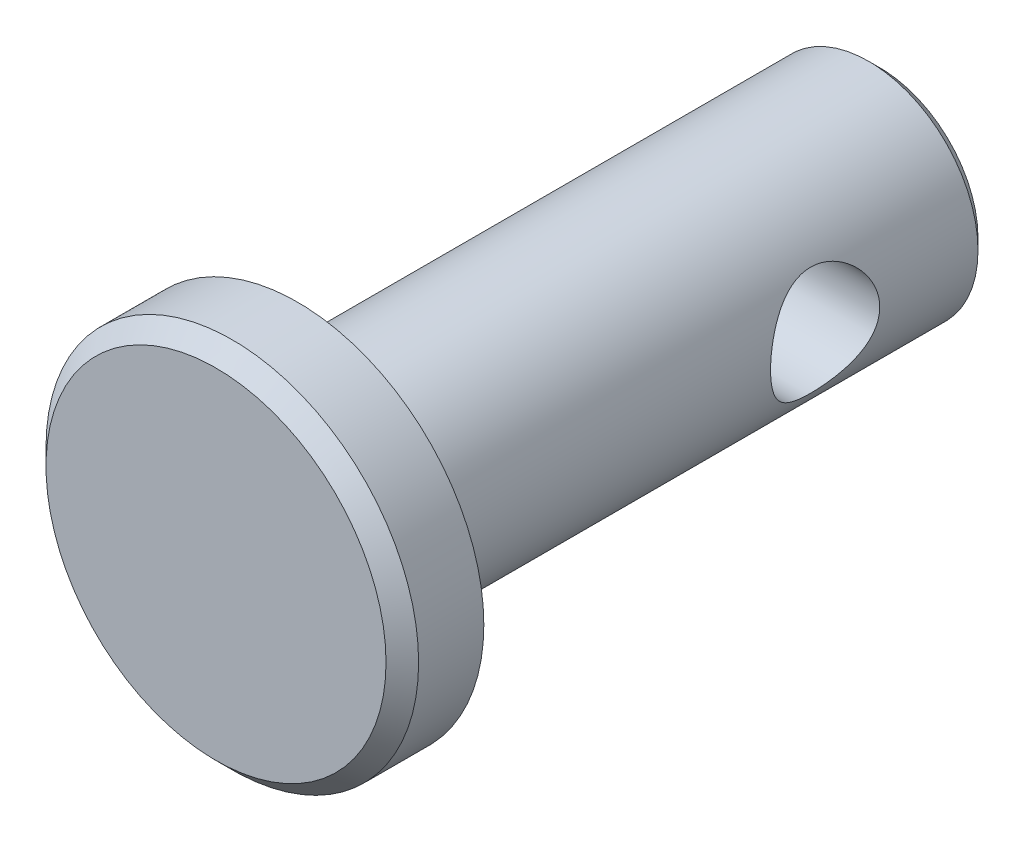
ISO-10303-21;
HEADER;
FILE_DESCRIPTION(('STEP AP214'),'2;1');
FILE_NAME('part.step','',(''),(''),'','','');
FILE_SCHEMA(('AUTOMOTIVE_DESIGN { 1 0 10303 214 1 1 1 1 }'));
ENDSEC;
DATA;
#1=APPLICATION_CONTEXT('core data for automotive mechanical design processes');
#2=APPLICATION_PROTOCOL_DEFINITION('international standard','automotive_design',2000,#1);
#3=PRODUCT_CONTEXT('',#1,'mechanical');
#4=PRODUCT('Part','Part','',(#3));
#5=PRODUCT_RELATED_PRODUCT_CATEGORY('part','',(#4));
#6=PRODUCT_DEFINITION_FORMATION('','',#4);
#7=PRODUCT_DEFINITION_CONTEXT('part definition',#1,'design');
#8=PRODUCT_DEFINITION('design','',#6,#7);
#9=PRODUCT_DEFINITION_SHAPE('','',#8);
#10=(LENGTH_UNIT() NAMED_UNIT(*) SI_UNIT(.MILLI.,.METRE.));
#11=(NAMED_UNIT(*) PLANE_ANGLE_UNIT() SI_UNIT($,.RADIAN.));
#12=(NAMED_UNIT(*) SI_UNIT($,.STERADIAN.) SOLID_ANGLE_UNIT());
#13=UNCERTAINTY_MEASURE_WITH_UNIT(LENGTH_MEASURE(1.E-05),#10,'distance_accuracy_value','');
#14=(GEOMETRIC_REPRESENTATION_CONTEXT(3) GLOBAL_UNCERTAINTY_ASSIGNED_CONTEXT((#13)) GLOBAL_UNIT_ASSIGNED_CONTEXT((#10,
#11,#12)) REPRESENTATION_CONTEXT('',''));
#15=CARTESIAN_POINT('',(0.,0.,0.));
#16=DIRECTION('',(0.,0.,1.));
#17=DIRECTION('',(1.,0.,0.));
#18=AXIS2_PLACEMENT_3D('',#15,#16,#17);
#19=CARTESIAN_POINT('',(0.,0.,6.35));
#20=DIRECTION('',(0.,0.,-1.));
#21=DIRECTION('',(-1.,0.,0.));
#22=AXIS2_PLACEMENT_3D('',#19,#20,#21);
#23=CYLINDRICAL_SURFACE('',#22,2.38125);
#24=CARTESIAN_POINT('',(0.,0.,-6.111875));
#25=DIRECTION('',(0.,0.,1.));
#26=DIRECTION('',(1.,0.,0.));
#27=AXIS2_PLACEMENT_3D('',#24,#25,#26);
#28=CIRCLE('',#27,2.38125);
#29=CARTESIAN_POINT('',(2.38125,0.,-6.111875));
#30=VERTEX_POINT('',#29);
#31=EDGE_CURVE('E37',#30,#30,#28,.T.);
#32=ORIENTED_EDGE('',*,*,#31,.T.);
#33=EDGE_LOOP('',(#32));
#34=FACE_BOUND('',#33,.T.);
#35=CARTESIAN_POINT('',(-2.38125,0.,-1.58749999999999));
#36=CARTESIAN_POINT('',(-2.38124658771817,-0.0625934933908996,-1.58750393182415));
#37=CARTESIAN_POINT('',(-2.37875553370113,-0.12526160776547,-1.59246499331048));
#38=CARTESIAN_POINT('',(-2.36903604532025,-0.248745655116469,-1.61208983565589));
#39=CARTESIAN_POINT('',(-2.36179861446384,-0.309557840743266,-1.62677204291282));
#40=CARTESIAN_POINT('',(-2.34334382664568,-0.427355251873435,-1.66512137838436));
#41=CARTESIAN_POINT('',(-2.33214194770735,-0.484354349749462,-1.68875358874528));
#42=CARTESIAN_POINT('',(-2.30678565164099,-0.593493959385318,-1.74415127106262));
#43=CARTESIAN_POINT('',(-2.29263146732421,-0.645634853781904,-1.77591610174628));
#44=CARTESIAN_POINT('',(-2.26166669988499,-0.747126495522786,-1.84886272516842));
#45=CARTESIAN_POINT('',(-2.24474721461222,-0.796117610742266,-1.89049796434469));
#46=CARTESIAN_POINT('',(-2.2105140207503,-0.886753026544747,-1.98102713622849));
#47=CARTESIAN_POINT('',(-2.19320002298882,-0.928391728636496,-2.02992654851655));
#48=CARTESIAN_POINT('',(-2.15859063769341,-1.00637816303612,-2.13814423802627));
#49=CARTESIAN_POINT('',(-2.14140081986313,-1.04206516514117,-2.19797641709309));
#50=CARTESIAN_POINT('',(-2.11081118475794,-1.10271904514174,-2.32374360940858));
#51=CARTESIAN_POINT('',(-2.09740866244572,-1.12769358094429,-2.38967422201051));
#52=CARTESIAN_POINT('',(-2.07713897941891,-1.16458893898079,-2.52174189114297));
#53=CARTESIAN_POINT('',(-2.06992860854359,-1.1772017235864,-2.58763030074273));
#54=CARTESIAN_POINT('',(-2.06194687719966,-1.19113338890835,-2.72094980373118));
#55=CARTESIAN_POINT('',(-2.06116915374352,-1.19246343021919,-2.78837930647471));
#56=CARTESIAN_POINT('',(-2.06586451337536,-1.18429955128952,-2.91419679770048));
#57=CARTESIAN_POINT('',(-2.07060121735085,-1.17608099119853,-2.97270173717494));
#58=CARTESIAN_POINT('',(-2.0845013483624,-1.15126275778341,-3.08735639834727));
#59=CARTESIAN_POINT('',(-2.09366618546583,-1.13466041470314,-3.14350536362913));
#60=CARTESIAN_POINT('',(-2.1155915160392,-1.09324351977209,-3.25345718596098));
#61=CARTESIAN_POINT('',(-2.12843079040573,-1.06824668928498,-3.30717493105432));
#62=CARTESIAN_POINT('',(-2.15626240722546,-1.01089025937972,-3.40991145461497));
#63=CARTESIAN_POINT('',(-2.17125571566414,-0.978527352789222,-3.45892810832385));
#64=CARTESIAN_POINT('',(-2.20400353628599,-0.902572396630542,-3.5574143665474));
#65=CARTESIAN_POINT('',(-2.22186710625626,-0.858076839495929,-3.60615334010161));
#66=CARTESIAN_POINT('',(-2.25680138992047,-0.761470860938951,-3.69578185775979));
#67=CARTESIAN_POINT('',(-2.27387172175947,-0.709356821108761,-3.73666765051534));
#68=CARTESIAN_POINT('',(-2.30626428608779,-0.595927464756047,-3.81121324016351));
#69=CARTESIAN_POINT('',(-2.3214685301789,-0.534297244998048,-3.8444493125057));
#70=CARTESIAN_POINT('',(-2.34741102209979,-0.405367587816351,-3.89980927520433));
#71=CARTESIAN_POINT('',(-2.35815281492167,-0.338072701740847,-3.92194198903368));
#72=CARTESIAN_POINT('',(-2.37320534860897,-0.205700104133525,-3.95264727755016));
#73=CARTESIAN_POINT('',(-2.37797504664999,-0.1409003848091,-3.962191127561));
#74=CARTESIAN_POINT('',(-2.38211931649743,-0.0104532111897002,-3.970493945507));
#75=CARTESIAN_POINT('',(-2.38149644415062,0.0551938267826006,-3.9692580225895));
#76=CARTESIAN_POINT('',(-2.37519200776753,0.180061757270823,-3.95659766160142));
#77=CARTESIAN_POINT('',(-2.36990626897501,0.239386357709476,-3.9459703282183));
#78=CARTESIAN_POINT('',(-2.35532022721706,0.355290706146969,-3.91607904564991));
#79=CARTESIAN_POINT('',(-2.34601948166815,0.411870150775843,-3.89681414431647));
#80=CARTESIAN_POINT('',(-2.323912493394,0.522551749435383,-3.849689325903));
#81=CARTESIAN_POINT('',(-2.31101362357334,0.576536816435452,-3.82159940595467));
#82=CARTESIAN_POINT('',(-2.28295169421308,0.679205558772778,-3.75788134037143));
#83=CARTESIAN_POINT('',(-2.26778767095513,0.727886962326196,-3.72224998349969));
#84=CARTESIAN_POINT('',(-2.23490101029918,0.823635905061685,-3.64042274358804));
#85=CARTESIAN_POINT('',(-2.21707334772675,0.870075505159962,-3.59353302224747));
#86=CARTESIAN_POINT('',(-2.18196785003363,0.954710182325452,-3.49258911676998));
#87=CARTESIAN_POINT('',(-2.1646904022613,0.992899556088159,-3.43853001790925));
#88=CARTESIAN_POINT('',(-2.13182825744162,1.06168973569882,-3.32147427421775));
#89=CARTESIAN_POINT('',(-2.11636605630571,1.0918334810305,-3.25817158617039));
#90=CARTESIAN_POINT('',(-2.090428799133,1.14071736472269,-3.12637082565359));
#91=CARTESIAN_POINT('',(-2.07994732092736,1.15947219672864,-3.05787957625952));
#92=CARTESIAN_POINT('',(-2.06646662138444,1.18331657161978,-2.92467876590558));
#93=CARTESIAN_POINT('',(-2.06284572182647,1.18954509883978,-2.86023734201105));
#94=CARTESIAN_POINT('',(-2.06175000375602,1.19144552443463,-2.73115833564985));
#95=CARTESIAN_POINT('',(-2.06427252119055,1.18712199863718,-2.66652085034461));
#96=CARTESIAN_POINT('',(-2.0745195450331,1.16910579328329,-2.54537745598844));
#97=CARTESIAN_POINT('',(-2.081725593681,1.1563448992644,-2.48868350273432));
#98=CARTESIAN_POINT('',(-2.09991741148739,1.12296816088622,-2.37830345780995));
#99=CARTESIAN_POINT('',(-2.11090439637645,1.10234978978715,-2.32461834007174));
#100=CARTESIAN_POINT('',(-2.13632093965266,1.05229312174863,-2.21778728679406));
#101=CARTESIAN_POINT('',(-2.15093219477964,1.02235532346272,-2.16491990438401));
#102=CARTESIAN_POINT('',(-2.18164566727434,0.955061000604871,-2.06461375535998));
#103=CARTESIAN_POINT('',(-2.19774865799103,0.917700616381019,-2.01717783335142));
#104=CARTESIAN_POINT('',(-2.23197328511557,0.831298335810092,-1.92308720225546));
#105=CARTESIAN_POINT('',(-2.25010245755217,0.781388641146489,-1.87722775625033));
#106=CARTESIAN_POINT('',(-2.28454448778714,0.674078066156024,-1.79435563536123));
#107=CARTESIAN_POINT('',(-2.30085636405197,0.616673173627613,-1.75734772899557));
#108=CARTESIAN_POINT('',(-2.33002942662263,0.495218557463752,-1.69318420558624));
#109=CARTESIAN_POINT('',(-2.34286539970213,0.431124721872153,-1.6661000982945));
#110=CARTESIAN_POINT('',(-2.36340659560876,0.298539814353399,-1.62344715007149));
#111=CARTESIAN_POINT('',(-2.37112639390897,0.230061848926335,-1.60784558236852));
#112=CARTESIAN_POINT('',(-2.37762409336193,0.134066692531781,-1.59476589493781));
#113=CARTESIAN_POINT('',(-2.37898025606987,0.107348987707655,-1.59204504322174));
#114=CARTESIAN_POINT('',(-2.3807939546427,0.0537587806828979,-1.58841122636904));
#115=CARTESIAN_POINT('',(-2.38125146570418,0.0268862742301639,-1.58749831113272));
#116=CARTESIAN_POINT('',(-2.38125,0.,-1.58749999999999));
#117=B_SPLINE_CURVE_WITH_KNOTS('',3,(#35,#36,#37,#38,#39,#40,#41,#42,#43,#44,#45,#46,#47,#48,
#49,#50,#51,#52,#53,#54,#55,#56,#57,#58,#59,#60,#61,#62,#63,#64,#65,#66,#67,#68,#69,#70,#71,#72,
#73,#74,#75,#76,#77,#78,#79,#80,#81,#82,#83,#84,#85,#86,#87,#88,#89,#90,#91,#92,#93,#94,#95,#96,
#97,#98,#99,#100,#101,#102,#103,#104,#105,#106,#107,#108,#109,#110,#111,#112,#113,#114,#115,
#116),.UNSPECIFIED.,.T.,.F.,(4,2,2,2,2,2,2,2,2,2,2,2,2,2,2,2,2,2,2,2,2,2,2,2,2,2,2,2,2,2,2,2,2,
2,2,2,2,2,2,2,4),(0.,0.187671381491036,0.375699515747514,0.563001503883019,0.750288727442431,
0.948906406473727,1.14767467670684,1.36185743031615,1.57588681716391,1.77710320704461,
1.97812053569865,2.15509926337348,2.33213438424011,2.51329317200606,2.69453345625452,
2.8987544577565,3.10307277131562,3.31687910824069,3.53051527011184,3.72645730217447,
3.92230647121477,4.10297598058852,4.28366541066829,4.46952119208218,4.65545627297242,
4.85965036423512,5.06398516445249,5.27821543446363,5.4921687202949,5.68558331740252,
5.8789140564582,6.05382723196981,6.22879670208068,6.41552156348467,6.60234377481073,
6.81186617152195,7.02150118957733,7.23261841267422,7.44313156831559,7.52374130413948,
7.60435326481741),.UNSPECIFIED.);
#118=CARTESIAN_POINT('',(-2.38125,0.,-1.58749999999999));
#119=VERTEX_POINT('',#118);
#120=EDGE_CURVE('E48',#119,#119,#117,.T.);
#121=ORIENTED_EDGE('',*,*,#120,.T.);
#122=EDGE_LOOP('',(#121));
#123=FACE_BOUND('',#122,.T.);
#124=CARTESIAN_POINT('',(2.38125,0.,-3.96874999999999));
#125=CARTESIAN_POINT('',(2.38124658771817,-0.0625934933908997,-3.96874606817584));
#126=CARTESIAN_POINT('',(2.37875553370113,-0.12526160776547,-3.9637850066895));
#127=CARTESIAN_POINT('',(2.36903604532025,-0.248745655116469,-3.94416016434409));
#128=CARTESIAN_POINT('',(2.36179861446383,-0.309557840743266,-3.92947795708717));
#129=CARTESIAN_POINT('',(2.34334382664568,-0.427355251873435,-3.89112862161562));
#130=CARTESIAN_POINT('',(2.33214194770735,-0.484354349749462,-3.86749641125471));
#131=CARTESIAN_POINT('',(2.30678565164099,-0.593493959385317,-3.81209872893736));
#132=CARTESIAN_POINT('',(2.29263146732421,-0.645634853781904,-3.78033389825371));
#133=CARTESIAN_POINT('',(2.26166669988499,-0.747126495522786,-3.70738727483156));
#134=CARTESIAN_POINT('',(2.24474721461222,-0.796117610742266,-3.6657520356553));
#135=CARTESIAN_POINT('',(2.2105140207503,-0.886753026544747,-3.5752228637715));
#136=CARTESIAN_POINT('',(2.19320002298882,-0.928391728636496,-3.52632345148343));
#137=CARTESIAN_POINT('',(2.15859063769341,-1.00637816303612,-3.41810576197372));
#138=CARTESIAN_POINT('',(2.14140081986313,-1.04206516514117,-3.35827358290689));
#139=CARTESIAN_POINT('',(2.11081118475794,-1.10271904514174,-3.23250639059141));
#140=CARTESIAN_POINT('',(2.09740866244572,-1.12769358094429,-3.16657577798947));
#141=CARTESIAN_POINT('',(2.07713897941891,-1.16458893898079,-3.03450810885702));
#142=CARTESIAN_POINT('',(2.06992860854359,-1.1772017235864,-2.96861969925725));
#143=CARTESIAN_POINT('',(2.06194687719966,-1.19113338890835,-2.8353001962688));
#144=CARTESIAN_POINT('',(2.06116915374352,-1.19246343021919,-2.76787069352527));
#145=CARTESIAN_POINT('',(2.06586451337536,-1.18429955128952,-2.64205320229951));
#146=CARTESIAN_POINT('',(2.07060121735085,-1.17608099119853,-2.58354826282505));
#147=CARTESIAN_POINT('',(2.0845013483624,-1.15126275778341,-2.46889360165271));
#148=CARTESIAN_POINT('',(2.09366618546583,-1.13466041470314,-2.41274463637085));
#149=CARTESIAN_POINT('',(2.1155915160392,-1.09324351977209,-2.302792814039));
#150=CARTESIAN_POINT('',(2.12843079040573,-1.06824668928498,-2.24907506894566));
#151=CARTESIAN_POINT('',(2.15626240722546,-1.01089025937972,-2.14633854538501));
#152=CARTESIAN_POINT('',(2.17125571566414,-0.978527352789222,-2.09732189167614));
#153=CARTESIAN_POINT('',(2.204003536286,-0.902572396630541,-1.99883563345259));
#154=CARTESIAN_POINT('',(2.22186710625626,-0.858076839495928,-1.95009665989838));
#155=CARTESIAN_POINT('',(2.25680138992047,-0.76147086093895,-1.8604681422402));
#156=CARTESIAN_POINT('',(2.27387172175947,-0.709356821108761,-1.81958234948465));
#157=CARTESIAN_POINT('',(2.30626428608779,-0.595927464756047,-1.74503675983647));
#158=CARTESIAN_POINT('',(2.3214685301789,-0.534297244998048,-1.71180068749428));
#159=CARTESIAN_POINT('',(2.34741102209979,-0.40536758781635,-1.65644072479566));
#160=CARTESIAN_POINT('',(2.35815281492167,-0.338072701740846,-1.63430801096631));
#161=CARTESIAN_POINT('',(2.37320534860897,-0.205700104133524,-1.60360272244982));
#162=CARTESIAN_POINT('',(2.37797504664999,-0.140900384809099,-1.59405887243898));
#163=CARTESIAN_POINT('',(2.38211931649743,-0.0104532111896996,-1.58575605449299));
#164=CARTESIAN_POINT('',(2.38149644415062,0.055193826782601,-1.58699197741048));
#165=CARTESIAN_POINT('',(2.37519200776753,0.180061757270823,-1.59965233839857));
#166=CARTESIAN_POINT('',(2.36990626897501,0.239386357709477,-1.61027967178168));
#167=CARTESIAN_POINT('',(2.35532022721706,0.35529070614697,-1.64017095435008));
#168=CARTESIAN_POINT('',(2.34601948166815,0.411870150775843,-1.65943585568352));
#169=CARTESIAN_POINT('',(2.323912493394,0.522551749435383,-1.70656067409698));
#170=CARTESIAN_POINT('',(2.31101362357334,0.576536816435452,-1.73465059404532));
#171=CARTESIAN_POINT('',(2.28295169421308,0.679205558772778,-1.79836865962856));
#172=CARTESIAN_POINT('',(2.26778767095513,0.727886962326196,-1.83400001650029));
#173=CARTESIAN_POINT('',(2.23490101029918,0.823635905061685,-1.91582725641194));
#174=CARTESIAN_POINT('',(2.21707334772675,0.870075505159963,-1.96271697775252));
#175=CARTESIAN_POINT('',(2.18196785003363,0.954710182325453,-2.06366088323001));
#176=CARTESIAN_POINT('',(2.1646904022613,0.99289955608816,-2.11771998209074));
#177=CARTESIAN_POINT('',(2.13182825744162,1.06168973569882,-2.23477572578224));
#178=CARTESIAN_POINT('',(2.11636605630571,1.0918334810305,-2.2980784138296));
#179=CARTESIAN_POINT('',(2.090428799133,1.14071736472269,-2.4298791743464));
#180=CARTESIAN_POINT('',(2.07994732092736,1.15947219672864,-2.49837042374047));
#181=CARTESIAN_POINT('',(2.06646662138444,1.18331657161978,-2.6315712340944));
#182=CARTESIAN_POINT('',(2.06284572182647,1.18954509883978,-2.69601265798894));
#183=CARTESIAN_POINT('',(2.06175000375602,1.19144552443463,-2.82509166435014));
#184=CARTESIAN_POINT('',(2.06427252119055,1.18712199863718,-2.88972914965538));
#185=CARTESIAN_POINT('',(2.0745195450331,1.16910579328329,-3.01087254401155));
#186=CARTESIAN_POINT('',(2.081725593681,1.1563448992644,-3.06756649726567));
#187=CARTESIAN_POINT('',(2.09991741148739,1.12296816088622,-3.17794654219003));
#188=CARTESIAN_POINT('',(2.11090439637645,1.10234978978715,-3.23163165992824));
#189=CARTESIAN_POINT('',(2.13632093965266,1.05229312174863,-3.33846271320592));
#190=CARTESIAN_POINT('',(2.15093219477964,1.02235532346272,-3.39133009561598));
#191=CARTESIAN_POINT('',(2.18164566727434,0.95506100060487,-3.49163624464));
#192=CARTESIAN_POINT('',(2.19774865799103,0.917700616381018,-3.53907216664857));
#193=CARTESIAN_POINT('',(2.23197328511557,0.831298335810091,-3.63316279774453));
#194=CARTESIAN_POINT('',(2.25010245755217,0.781388641146488,-3.67902224374966));
#195=CARTESIAN_POINT('',(2.28454448778714,0.674078066156024,-3.76189436463876));
#196=CARTESIAN_POINT('',(2.30085636405197,0.616673173627613,-3.79890227100442));
#197=CARTESIAN_POINT('',(2.33002942662263,0.495218557463752,-3.86306579441374));
#198=CARTESIAN_POINT('',(2.34286539970213,0.431124721872153,-3.89014990170548));
#199=CARTESIAN_POINT('',(2.36340659560876,0.298539814353399,-3.9328028499285));
#200=CARTESIAN_POINT('',(2.37112639390897,0.230061848926334,-3.94840441763146));
#201=CARTESIAN_POINT('',(2.37762409336193,0.134066692531781,-3.96148410506218));
#202=CARTESIAN_POINT('',(2.37898025606987,0.107348987707655,-3.96420495677824));
#203=CARTESIAN_POINT('',(2.3807939546427,0.0537587806828978,-3.96783877363094));
#204=CARTESIAN_POINT('',(2.38125146570418,0.0268862742301638,-3.96875168886727));
#205=CARTESIAN_POINT('',(2.38125,0.,-3.96874999999999));
#206=B_SPLINE_CURVE_WITH_KNOTS('',3,(#124,#125,#126,#127,#128,#129,#130,#131,#132,#133,#134,
#135,#136,#137,#138,#139,#140,#141,#142,#143,#144,#145,#146,#147,#148,#149,#150,#151,#152,#153,
#154,#155,#156,#157,#158,#159,#160,#161,#162,#163,#164,#165,#166,#167,#168,#169,#170,#171,#172,
#173,#174,#175,#176,#177,#178,#179,#180,#181,#182,#183,#184,#185,#186,#187,#188,#189,#190,#191,
#192,#193,#194,#195,#196,#197,#198,#199,#200,#201,#202,#203,#204,#205),.UNSPECIFIED.,.T.,.F.,(4,
2,2,2,2,2,2,2,2,2,2,2,2,2,2,2,2,2,2,2,2,2,2,2,2,2,2,2,2,2,2,2,2,2,2,2,2,2,2,2,4),(0.,
0.187671381491036,0.375699515747514,0.563001503883018,0.75028872744243,0.948906406473726,
1.14767467670684,1.36185743031615,1.57588681716391,1.77710320704461,1.97812053569865,
2.15509926337348,2.33213438424011,2.51329317200606,2.69453345625452,2.8987544577565,
3.10307277131562,3.31687910824069,3.53051527011184,3.72645730217447,3.92230647121477,
4.10297598058852,4.28366541066829,4.46952119208218,4.65545627297242,4.85965036423512,
5.06398516445249,5.27821543446363,5.4921687202949,5.68558331740252,5.8789140564582,
6.05382723196981,6.22879670208068,6.41552156348467,6.60234377481073,6.81186617152195,
7.02150118957733,7.23261841267422,7.44313156831559,7.52374130413948,7.60435326481741),.UNSPECIFIED.);
#207=CARTESIAN_POINT('',(2.38125,0.,-3.96874999999999));
#208=VERTEX_POINT('',#207);
#209=EDGE_CURVE('E57',#208,#208,#206,.T.);
#210=ORIENTED_EDGE('',*,*,#209,.T.);
#211=EDGE_LOOP('',(#210));
#212=FACE_BOUND('',#211,.T.);
#213=CARTESIAN_POINT('',(0.,0.,6.35));
#214=DIRECTION('',(0.,0.,1.));
#215=DIRECTION('',(1.,0.,0.));
#216=AXIS2_PLACEMENT_3D('',#213,#214,#215);
#217=CIRCLE('',#216,2.38125);
#218=CARTESIAN_POINT('',(2.38125,0.,6.35));
#219=VERTEX_POINT('',#218);
#220=EDGE_CURVE('E96',#219,#219,#217,.T.);
#221=ORIENTED_EDGE('',*,*,#220,.F.);
#222=EDGE_LOOP('',(#221));
#223=FACE_BOUND('',#222,.T.);
#224=ADVANCED_FACE('F30',(#34,#123,#212,#223),#23,.T.);
#225=CARTESIAN_POINT('',(0.,0.,-6.35));
#226=DIRECTION('',(0.,0.,1.));
#227=DIRECTION('',(1.,0.,0.));
#228=AXIS2_PLACEMENT_3D('',#225,#226,#227);
#229=PLANE('',#228);
#230=CARTESIAN_POINT('',(0.,0.,-6.35));
#231=DIRECTION('',(0.,0.,1.));
#232=DIRECTION('',(1.,0.,0.));
#233=AXIS2_PLACEMENT_3D('',#230,#231,#232);
#234=CIRCLE('',#233,2.143125);
#235=CARTESIAN_POINT('',(2.143125,0.,-6.35));
#236=VERTEX_POINT('',#235);
#237=EDGE_CURVE('E10',#236,#236,#234,.F.);
#238=ORIENTED_EDGE('',*,*,#237,.T.);
#239=EDGE_LOOP('',(#238));
#240=FACE_BOUND('',#239,.T.);
#241=ADVANCED_FACE('F78',(#240),#229,.F.);
#242=CARTESIAN_POINT('',(0.,0.,6.35));
#243=DIRECTION('',(0.,0.,1.));
#244=DIRECTION('',(1.,0.,0.));
#245=AXIS2_PLACEMENT_3D('',#242,#243,#244);
#246=PLANE('',#245);
#247=CARTESIAN_POINT('',(0.,0.,6.35));
#248=DIRECTION('',(0.,0.,1.));
#249=DIRECTION('',(1.,0.,0.));
#250=AXIS2_PLACEMENT_3D('',#247,#248,#249);
#251=CIRCLE('',#250,4.064);
#252=CARTESIAN_POINT('',(4.064,0.,6.35));
#253=VERTEX_POINT('',#252);
#254=EDGE_CURVE('E56',#253,#253,#251,.T.);
#255=ORIENTED_EDGE('',*,*,#254,.F.);
#256=EDGE_LOOP('',(#255));
#257=FACE_BOUND('',#256,.T.);
#258=ORIENTED_EDGE('',*,*,#220,.T.);
#259=EDGE_LOOP('',(#258));
#260=FACE_BOUND('',#259,.T.);
#261=ADVANCED_FACE('F75',(#257,#260),#246,.F.);
#262=CARTESIAN_POINT('',(0.,0.,8.128));
#263=DIRECTION('',(0.,0.,-1.));
#264=DIRECTION('',(-1.,0.,0.));
#265=AXIS2_PLACEMENT_3D('',#262,#263,#264);
#266=CYLINDRICAL_SURFACE('',#265,4.064);
#267=CARTESIAN_POINT('',(0.,0.,7.7724));
#268=DIRECTION('',(0.,0.,1.));
#269=DIRECTION('',(1.,0.,0.));
#270=AXIS2_PLACEMENT_3D('',#267,#268,#269);
#271=CIRCLE('',#270,4.064);
#272=CARTESIAN_POINT('',(4.064,0.,7.7724));
#273=VERTEX_POINT('',#272);
#274=EDGE_CURVE('E41',#273,#273,#271,.F.);
#275=ORIENTED_EDGE('',*,*,#274,.T.);
#276=EDGE_LOOP('',(#275));
#277=FACE_BOUND('',#276,.T.);
#278=ORIENTED_EDGE('',*,*,#254,.T.);
#279=EDGE_LOOP('',(#278));
#280=FACE_BOUND('',#279,.T.);
#281=ADVANCED_FACE('F73',(#277,#280),#266,.T.);
#282=CARTESIAN_POINT('',(0.,0.,8.128));
#283=DIRECTION('',(0.,0.,1.));
#284=DIRECTION('',(1.,0.,0.));
#285=AXIS2_PLACEMENT_3D('',#282,#283,#284);
#286=PLANE('',#285);
#287=CARTESIAN_POINT('',(0.,0.,8.128));
#288=DIRECTION('',(0.,0.,1.));
#289=DIRECTION('',(1.,0.,0.));
#290=AXIS2_PLACEMENT_3D('',#287,#288,#289);
#291=CIRCLE('',#290,3.7084);
#292=CARTESIAN_POINT('',(3.7084,0.,8.128));
#293=VERTEX_POINT('',#292);
#294=EDGE_CURVE('E45',#293,#293,#291,.T.);
#295=ORIENTED_EDGE('',*,*,#294,.T.);
#296=EDGE_LOOP('',(#295));
#297=FACE_BOUND('',#296,.T.);
#298=ADVANCED_FACE('F69',(#297),#286,.T.);
#299=CARTESIAN_POINT('',(0.,0.,8.128));
#300=DIRECTION('',(0.,0.,-1.));
#301=DIRECTION('',(-1.,0.,0.));
#302=AXIS2_PLACEMENT_3D('',#299,#300,#301);
#303=CONICAL_SURFACE('',#302,3.7084,0.78539816339745);
#304=ORIENTED_EDGE('',*,*,#274,.F.);
#305=EDGE_LOOP('',(#304));
#306=FACE_BOUND('',#305,.T.);
#307=ORIENTED_EDGE('',*,*,#294,.F.);
#308=EDGE_LOOP('',(#307));
#309=FACE_BOUND('',#308,.T.);
#310=ADVANCED_FACE('F67',(#306,#309),#303,.T.);
#311=CARTESIAN_POINT('',(-4.064,0.,-2.77812499999999));
#312=DIRECTION('',(1.,0.,0.));
#313=DIRECTION('',(0.,0.,-1.));
#314=AXIS2_PLACEMENT_3D('',#311,#312,#313);
#315=CYLINDRICAL_SURFACE('',#314,1.190625);
#316=ORIENTED_EDGE('',*,*,#209,.F.);
#317=EDGE_LOOP('',(#316));
#318=FACE_BOUND('',#317,.T.);
#319=ORIENTED_EDGE('',*,*,#120,.F.);
#320=EDGE_LOOP('',(#319));
#321=FACE_BOUND('',#320,.T.);
#322=ADVANCED_FACE('F63',(#318,#321),#315,.F.);
#323=CARTESIAN_POINT('',(0.,0.,-6.111875));
#324=DIRECTION('',(0.,0.,1.));
#325=DIRECTION('',(1.,0.,0.));
#326=AXIS2_PLACEMENT_3D('',#323,#324,#325);
#327=CONICAL_SURFACE('',#326,2.38125,0.785398163397452);
#328=ORIENTED_EDGE('',*,*,#237,.F.);
#329=EDGE_LOOP('',(#328));
#330=FACE_BOUND('',#329,.T.);
#331=ORIENTED_EDGE('',*,*,#31,.F.);
#332=EDGE_LOOP('',(#331));
#333=FACE_BOUND('',#332,.T.);
#334=ADVANCED_FACE('F32',(#330,#333),#327,.T.);
#335=CLOSED_SHELL('',(#224,#241,#261,#281,#298,#310,#322,#334));
#336=MANIFOLD_SOLID_BREP('B2',#335);
#337=ADVANCED_BREP_SHAPE_REPRESENTATION('',(#18,#336),#14);
#338=SHAPE_DEFINITION_REPRESENTATION(#9,#337);
ENDSEC;
END-ISO-10303-21;
